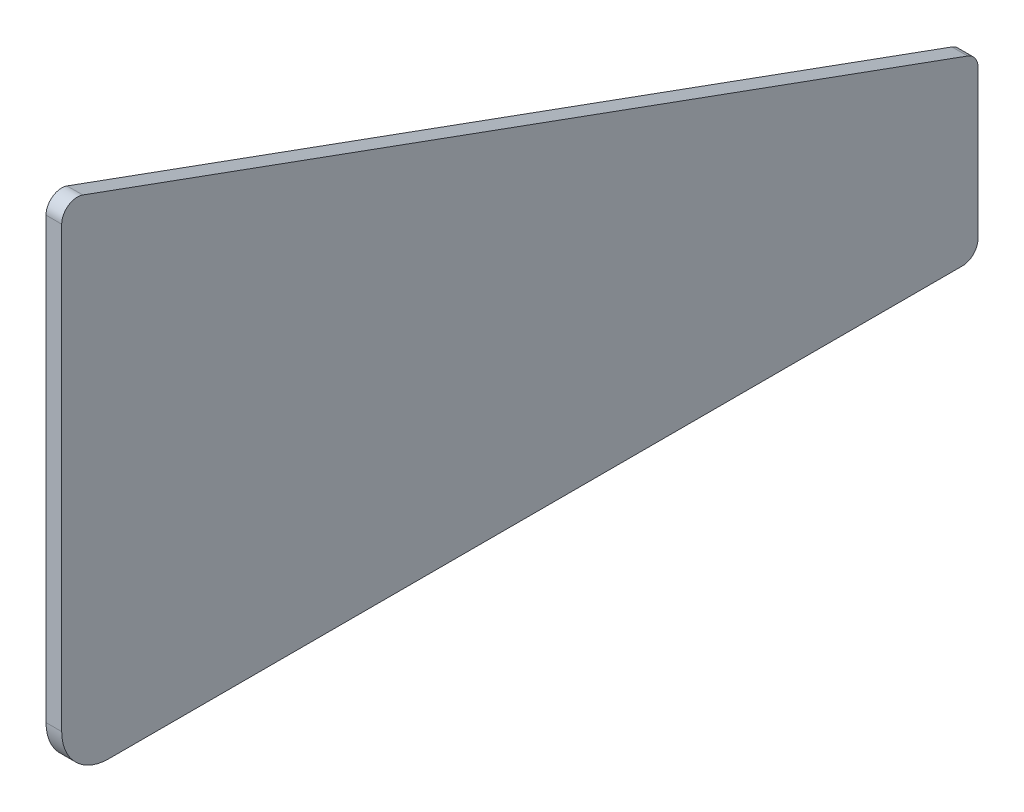
ISO-10303-21;
HEADER;
FILE_DESCRIPTION(('STEP AP214'),'2;1');
FILE_NAME('part.step','',(''),(''),'','','');
FILE_SCHEMA(('AUTOMOTIVE_DESIGN { 1 0 10303 214 1 1 1 1 }'));
ENDSEC;
DATA;
#1=APPLICATION_CONTEXT('core data for automotive mechanical design processes');
#2=APPLICATION_PROTOCOL_DEFINITION('international standard','automotive_design',2000,#1);
#3=PRODUCT_CONTEXT('',#1,'mechanical');
#4=PRODUCT('Part','Part','',(#3));
#5=PRODUCT_RELATED_PRODUCT_CATEGORY('part','',(#4));
#6=PRODUCT_DEFINITION_FORMATION('','',#4);
#7=PRODUCT_DEFINITION_CONTEXT('part definition',#1,'design');
#8=PRODUCT_DEFINITION('design','',#6,#7);
#9=PRODUCT_DEFINITION_SHAPE('','',#8);
#10=(LENGTH_UNIT() NAMED_UNIT(*) SI_UNIT(.MILLI.,.METRE.));
#11=(NAMED_UNIT(*) PLANE_ANGLE_UNIT() SI_UNIT($,.RADIAN.));
#12=(NAMED_UNIT(*) SI_UNIT($,.STERADIAN.) SOLID_ANGLE_UNIT());
#13=UNCERTAINTY_MEASURE_WITH_UNIT(LENGTH_MEASURE(1.E-05),#10,'distance_accuracy_value','');
#14=(GEOMETRIC_REPRESENTATION_CONTEXT(3) GLOBAL_UNCERTAINTY_ASSIGNED_CONTEXT((#13)) GLOBAL_UNIT_ASSIGNED_CONTEXT((#10,
#11,#12)) REPRESENTATION_CONTEXT('',''));
#15=CARTESIAN_POINT('',(0.,0.,0.));
#16=DIRECTION('',(0.,0.,1.));
#17=DIRECTION('',(1.,0.,0.));
#18=AXIS2_PLACEMENT_3D('',#15,#16,#17);
#19=CARTESIAN_POINT('',(10.,-294.281480067421,-30.));
#20=DIRECTION('',(-1.,0.,0.));
#21=DIRECTION('',(0.,0.,1.));
#22=AXIS2_PLACEMENT_3D('',#19,#20,#21);
#23=CYLINDRICAL_SURFACE('',#22,30.);
#24=CARTESIAN_POINT('',(0.,-294.281480067421,-30.));
#25=DIRECTION('',(1.,0.,0.));
#26=DIRECTION('',(0.,0.,1.));
#27=AXIS2_PLACEMENT_3D('',#24,#25,#26);
#28=CIRCLE('',#27,30.);
#29=CARTESIAN_POINT('',(0.,-294.281480067421,0.));
#30=VERTEX_POINT('',#29);
#31=CARTESIAN_POINT('',(0.,-324.281480067421,-30.));
#32=VERTEX_POINT('',#31);
#33=EDGE_CURVE('E240',#30,#32,#28,.T.);
#34=ORIENTED_EDGE('',*,*,#33,.T.);
#35=DIRECTION('',(-1.,0.,0.));
#36=VECTOR('',#35,1.);
#37=CARTESIAN_POINT('',(10.,-324.281480067421,-30.));
#38=LINE('',#37,#36);
#39=CARTESIAN_POINT('',(10.,-324.281480067421,-30.));
#40=VERTEX_POINT('',#39);
#41=EDGE_CURVE('E11',#40,#32,#38,.T.);
#42=ORIENTED_EDGE('',*,*,#41,.F.);
#43=CARTESIAN_POINT('',(10.,-294.281480067421,-30.));
#44=DIRECTION('',(1.,0.,0.));
#45=DIRECTION('',(0.,0.,1.));
#46=AXIS2_PLACEMENT_3D('',#43,#44,#45);
#47=CIRCLE('',#46,30.);
#48=CARTESIAN_POINT('',(10.,-294.281480067421,0.));
#49=VERTEX_POINT('',#48);
#50=EDGE_CURVE('E246',#49,#40,#47,.T.);
#51=ORIENTED_EDGE('',*,*,#50,.F.);
#52=DIRECTION('',(-1.,0.,0.));
#53=VECTOR('',#52,1.);
#54=CARTESIAN_POINT('',(10.,-294.281480067421,0.));
#55=LINE('',#54,#53);
#56=EDGE_CURVE('E264',#49,#30,#55,.T.);
#57=ORIENTED_EDGE('',*,*,#56,.T.);
#58=EDGE_LOOP('',(#34,#42,#51,#57));
#59=FACE_BOUND('',#58,.T.);
#60=ADVANCED_FACE('F34',(#59),#23,.T.);
#61=CARTESIAN_POINT('',(10.,-324.281480067421,-30.));
#62=DIRECTION('',(0.,1.,0.));
#63=DIRECTION('',(0.,0.,1.));
#64=AXIS2_PLACEMENT_3D('',#61,#62,#63);
#65=PLANE('',#64);
#66=DIRECTION('',(0.,0.,-1.));
#67=VECTOR('',#66,1.);
#68=CARTESIAN_POINT('',(0.,-324.281480067421,-30.));
#69=LINE('',#68,#67);
#70=CARTESIAN_POINT('',(0.,-324.281480067421,-573.815572471544));
#71=VERTEX_POINT('',#70);
#72=EDGE_CURVE('E267',#32,#71,#69,.T.);
#73=ORIENTED_EDGE('',*,*,#72,.T.);
#74=DIRECTION('',(-1.,0.,0.));
#75=VECTOR('',#74,1.);
#76=CARTESIAN_POINT('',(10.,-324.281480067421,-573.815572471544));
#77=LINE('',#76,#75);
#78=CARTESIAN_POINT('',(10.,-324.281480067421,-573.815572471544));
#79=VERTEX_POINT('',#78);
#80=EDGE_CURVE('E41',#79,#71,#77,.T.);
#81=ORIENTED_EDGE('',*,*,#80,.F.);
#82=DIRECTION('',(0.,0.,-1.));
#83=VECTOR('',#82,1.);
#84=CARTESIAN_POINT('',(10.,-324.281480067421,-30.));
#85=LINE('',#84,#83);
#86=EDGE_CURVE('E249',#40,#79,#85,.T.);
#87=ORIENTED_EDGE('',*,*,#86,.F.);
#88=ORIENTED_EDGE('',*,*,#41,.T.);
#89=EDGE_LOOP('',(#73,#81,#87,#88));
#90=FACE_BOUND('',#89,.T.);
#91=ADVANCED_FACE('F324',(#90),#65,.F.);
#92=CARTESIAN_POINT('',(10.,-314.281480067421,-573.815572471544));
#93=DIRECTION('',(-1.,0.,0.));
#94=DIRECTION('',(0.,0.,1.));
#95=AXIS2_PLACEMENT_3D('',#92,#93,#94);
#96=CYLINDRICAL_SURFACE('',#95,10.);
#97=CARTESIAN_POINT('',(0.,-314.281480067421,-573.815572471544));
#98=DIRECTION('',(1.,0.,0.));
#99=DIRECTION('',(0.,0.,-1.));
#100=AXIS2_PLACEMENT_3D('',#97,#98,#99);
#101=CIRCLE('',#100,10.);
#102=CARTESIAN_POINT('',(0.,-314.281480067421,-583.815572471544));
#103=VERTEX_POINT('',#102);
#104=EDGE_CURVE('E269',#71,#103,#101,.T.);
#105=ORIENTED_EDGE('',*,*,#104,.T.);
#106=DIRECTION('',(-1.,0.,0.));
#107=VECTOR('',#106,1.);
#108=CARTESIAN_POINT('',(10.,-314.281480067421,-583.815572471544));
#109=LINE('',#108,#107);
#110=CARTESIAN_POINT('',(10.,-314.281480067421,-583.815572471544));
#111=VERTEX_POINT('',#110);
#112=EDGE_CURVE('E294',#111,#103,#109,.T.);
#113=ORIENTED_EDGE('',*,*,#112,.F.);
#114=CARTESIAN_POINT('',(10.,-314.281480067421,-573.815572471544));
#115=DIRECTION('',(1.,0.,0.));
#116=DIRECTION('',(0.,0.,-1.));
#117=AXIS2_PLACEMENT_3D('',#114,#115,#116);
#118=CIRCLE('',#117,10.);
#119=EDGE_CURVE('E252',#79,#111,#118,.T.);
#120=ORIENTED_EDGE('',*,*,#119,.F.);
#121=ORIENTED_EDGE('',*,*,#80,.T.);
#122=EDGE_LOOP('',(#105,#113,#120,#121));
#123=FACE_BOUND('',#122,.T.);
#124=ADVANCED_FACE('F301',(#123),#96,.T.);
#125=CARTESIAN_POINT('',(10.,-314.281480067421,-583.815572471544));
#126=DIRECTION('',(0.,0.,1.));
#127=DIRECTION('',(1.,0.,0.));
#128=AXIS2_PLACEMENT_3D('',#125,#126,#127);
#129=PLANE('',#128);
#130=DIRECTION('',(0.,1.,0.));
#131=VECTOR('',#130,1.);
#132=CARTESIAN_POINT('',(0.,-314.281480067421,-583.815572471544));
#133=LINE('',#132,#131);
#134=CARTESIAN_POINT('',(0.,-219.493566062825,-583.815572471544));
#135=VERTEX_POINT('',#134);
#136=EDGE_CURVE('E271',#103,#135,#133,.T.);
#137=ORIENTED_EDGE('',*,*,#136,.T.);
#138=DIRECTION('',(-1.,0.,0.));
#139=VECTOR('',#138,1.);
#140=CARTESIAN_POINT('',(10.,-219.493566062825,-583.815572471544));
#141=LINE('',#140,#139);
#142=CARTESIAN_POINT('',(10.,-219.493566062825,-583.815572471544));
#143=VERTEX_POINT('',#142);
#144=EDGE_CURVE('E291',#143,#135,#141,.T.);
#145=ORIENTED_EDGE('',*,*,#144,.F.);
#146=DIRECTION('',(0.,1.,0.));
#147=VECTOR('',#146,1.);
#148=CARTESIAN_POINT('',(10.,-314.281480067421,-583.815572471544));
#149=LINE('',#148,#147);
#150=EDGE_CURVE('E254',#111,#143,#149,.T.);
#151=ORIENTED_EDGE('',*,*,#150,.F.);
#152=ORIENTED_EDGE('',*,*,#112,.T.);
#153=EDGE_LOOP('',(#137,#145,#151,#152));
#154=FACE_BOUND('',#153,.T.);
#155=ADVANCED_FACE('F312',(#154),#129,.F.);
#156=CARTESIAN_POINT('',(10.,-219.493566062825,-573.815572471544));
#157=DIRECTION('',(-1.,0.,0.));
#158=DIRECTION('',(0.,0.,1.));
#159=AXIS2_PLACEMENT_3D('',#156,#157,#158);
#160=CYLINDRICAL_SURFACE('',#159,10.);
#161=CARTESIAN_POINT('',(0.,-219.493566062825,-573.815572471544));
#162=DIRECTION('',(1.,0.,0.));
#163=DIRECTION('',(0.,0.,-1.));
#164=AXIS2_PLACEMENT_3D('',#161,#162,#163);
#165=CIRCLE('',#164,10.);
#166=CARTESIAN_POINT('',(0.,-210.096639854966,-577.235773904801));
#167=VERTEX_POINT('',#166);
#168=EDGE_CURVE('E273',#135,#167,#165,.T.);
#169=ORIENTED_EDGE('',*,*,#168,.T.);
#170=DIRECTION('',(-1.,0.,0.));
#171=VECTOR('',#170,1.);
#172=CARTESIAN_POINT('',(10.,-210.096639854966,-577.235773904801));
#173=LINE('',#172,#171);
#174=CARTESIAN_POINT('',(10.,-210.096639854966,-577.235773904801));
#175=VERTEX_POINT('',#174);
#176=EDGE_CURVE('E288',#175,#167,#173,.T.);
#177=ORIENTED_EDGE('',*,*,#176,.F.);
#178=CARTESIAN_POINT('',(10.,-219.493566062825,-573.815572471544));
#179=DIRECTION('',(1.,0.,0.));
#180=DIRECTION('',(0.,0.,-1.));
#181=AXIS2_PLACEMENT_3D('',#178,#179,#180);
#182=CIRCLE('',#181,10.);
#183=EDGE_CURVE('E256',#143,#175,#182,.T.);
#184=ORIENTED_EDGE('',*,*,#183,.F.);
#185=ORIENTED_EDGE('',*,*,#144,.T.);
#186=EDGE_LOOP('',(#169,#177,#184,#185));
#187=FACE_BOUND('',#186,.T.);
#188=ADVANCED_FACE('F316',(#187),#160,.T.);
#189=CARTESIAN_POINT('',(10.,-210.096639854966,-577.235773904801));
#190=DIRECTION('',(0.,-0.939692620785907,0.342020143325672));
#191=DIRECTION('',(0.,-0.342020143325672,-0.939692620785907));
#192=AXIS2_PLACEMENT_3D('',#189,#190,#191);
#193=PLANE('',#192);
#194=DIRECTION('',(0.,0.342020143325672,0.939692620785907));
#195=VECTOR('',#194,1.);
#196=CARTESIAN_POINT('',(0.,-210.096639854966,-577.235773904801));
#197=LINE('',#196,#195);
#198=CARTESIAN_POINT('',(0.,-4.88455385956217,-13.4202014332568));
#199=VERTEX_POINT('',#198);
#200=EDGE_CURVE('E275',#167,#199,#197,.T.);
#201=ORIENTED_EDGE('',*,*,#200,.T.);
#202=DIRECTION('',(-1.,0.,0.));
#203=VECTOR('',#202,1.);
#204=CARTESIAN_POINT('',(10.,-4.88455385956217,-13.4202014332568));
#205=LINE('',#204,#203);
#206=CARTESIAN_POINT('',(10.,-4.88455385956217,-13.4202014332568));
#207=VERTEX_POINT('',#206);
#208=EDGE_CURVE('E285',#207,#199,#205,.T.);
#209=ORIENTED_EDGE('',*,*,#208,.F.);
#210=DIRECTION('',(0.,0.342020143325672,0.939692620785907));
#211=VECTOR('',#210,1.);
#212=CARTESIAN_POINT('',(10.,-210.096639854966,-577.235773904801));
#213=LINE('',#212,#211);
#214=EDGE_CURVE('E258',#175,#207,#213,.T.);
#215=ORIENTED_EDGE('',*,*,#214,.F.);
#216=ORIENTED_EDGE('',*,*,#176,.T.);
#217=EDGE_LOOP('',(#201,#209,#215,#216));
#218=FACE_BOUND('',#217,.T.);
#219=ADVANCED_FACE('F337',(#218),#193,.F.);
#220=CARTESIAN_POINT('',(10.,-14.2814800674212,-10.));
#221=DIRECTION('',(-1.,0.,0.));
#222=DIRECTION('',(0.,0.,1.));
#223=AXIS2_PLACEMENT_3D('',#220,#221,#222);
#224=CYLINDRICAL_SURFACE('',#223,10.);
#225=CARTESIAN_POINT('',(0.,-14.2814800674212,-10.));
#226=DIRECTION('',(1.,0.,0.));
#227=DIRECTION('',(0.,0.,-1.));
#228=AXIS2_PLACEMENT_3D('',#225,#226,#227);
#229=CIRCLE('',#228,10.);
#230=CARTESIAN_POINT('',(0.,-14.2814800674213,0.));
#231=VERTEX_POINT('',#230);
#232=EDGE_CURVE('E277',#199,#231,#229,.T.);
#233=ORIENTED_EDGE('',*,*,#232,.T.);
#234=DIRECTION('',(-1.,0.,0.));
#235=VECTOR('',#234,1.);
#236=CARTESIAN_POINT('',(10.,-14.2814800674213,0.));
#237=LINE('',#236,#235);
#238=CARTESIAN_POINT('',(10.,-14.2814800674213,0.));
#239=VERTEX_POINT('',#238);
#240=EDGE_CURVE('E282',#239,#231,#237,.T.);
#241=ORIENTED_EDGE('',*,*,#240,.F.);
#242=CARTESIAN_POINT('',(10.,-14.2814800674212,-10.));
#243=DIRECTION('',(1.,0.,0.));
#244=DIRECTION('',(0.,0.,-1.));
#245=AXIS2_PLACEMENT_3D('',#242,#243,#244);
#246=CIRCLE('',#245,10.);
#247=EDGE_CURVE('E260',#207,#239,#246,.T.);
#248=ORIENTED_EDGE('',*,*,#247,.F.);
#249=ORIENTED_EDGE('',*,*,#208,.T.);
#250=EDGE_LOOP('',(#233,#241,#248,#249));
#251=FACE_BOUND('',#250,.T.);
#252=ADVANCED_FACE('F335',(#251),#224,.T.);
#253=CARTESIAN_POINT('',(10.,-14.2814800674213,0.));
#254=DIRECTION('',(0.,0.,-1.));
#255=DIRECTION('',(0.,1.,0.));
#256=AXIS2_PLACEMENT_3D('',#253,#254,#255);
#257=PLANE('',#256);
#258=DIRECTION('',(0.,-1.,0.));
#259=VECTOR('',#258,1.);
#260=CARTESIAN_POINT('',(0.,-14.2814800674213,0.));
#261=LINE('',#260,#259);
#262=EDGE_CURVE('E250',#231,#30,#261,.T.);
#263=ORIENTED_EDGE('',*,*,#262,.T.);
#264=ORIENTED_EDGE('',*,*,#56,.F.);
#265=DIRECTION('',(0.,-1.,0.));
#266=VECTOR('',#265,1.);
#267=CARTESIAN_POINT('',(10.,-14.2814800674213,0.));
#268=LINE('',#267,#266);
#269=EDGE_CURVE('E262',#239,#49,#268,.T.);
#270=ORIENTED_EDGE('',*,*,#269,.F.);
#271=ORIENTED_EDGE('',*,*,#240,.T.);
#272=EDGE_LOOP('',(#263,#264,#270,#271));
#273=FACE_BOUND('',#272,.T.);
#274=ADVANCED_FACE('F330',(#273),#257,.F.);
#275=CARTESIAN_POINT('',(10.,-294.281480067421,-30.));
#276=DIRECTION('',(-1.,0.,0.));
#277=DIRECTION('',(0.,0.,1.));
#278=AXIS2_PLACEMENT_3D('',#275,#276,#277);
#279=PLANE('',#278);
#280=ORIENTED_EDGE('',*,*,#50,.T.);
#281=ORIENTED_EDGE('',*,*,#86,.T.);
#282=ORIENTED_EDGE('',*,*,#119,.T.);
#283=ORIENTED_EDGE('',*,*,#150,.T.);
#284=ORIENTED_EDGE('',*,*,#183,.T.);
#285=ORIENTED_EDGE('',*,*,#214,.T.);
#286=ORIENTED_EDGE('',*,*,#247,.T.);
#287=ORIENTED_EDGE('',*,*,#269,.T.);
#288=EDGE_LOOP('',(#280,#281,#282,#283,#284,#285,#286,#287));
#289=FACE_BOUND('',#288,.T.);
#290=ADVANCED_FACE('F320',(#289),#279,.F.);
#291=CARTESIAN_POINT('',(0.,-294.281480067421,-30.));
#292=DIRECTION('',(-1.,0.,0.));
#293=DIRECTION('',(0.,0.,1.));
#294=AXIS2_PLACEMENT_3D('',#291,#292,#293);
#295=PLANE('',#294);
#296=CARTESIAN_POINT('',(0.,-205.316311304833,-356.320107689534));
#297=CARTESIAN_POINT('',(0.,-205.964445920581,-352.838937222534));
#298=CARTESIAN_POINT('',(0.,-217.989087479131,-121.396454164475));
#299=CARTESIAN_POINT('',(0.,-66.6295550857602,-35.3127262433403));
#300=CARTESIAN_POINT('',(0.,-47.7372149956287,-26.9501856712703));
#301=B_SPLINE_CURVE_WITH_KNOTS('',3,(#296,#297,#298,#299,#300),.UNSPECIFIED.,.F.,.F.,(4,1,4),
(0.,0.409684669558369,1.),.UNSPECIFIED.);
#302=CARTESIAN_POINT('',(0.,-205.316311304832,-356.320107689534));
#303=VERTEX_POINT('',#302);
#304=CARTESIAN_POINT('',(0.,-47.7372149956287,-26.9501856712703));
#305=VERTEX_POINT('',#304);
#306=EDGE_CURVE('E48',#303,#305,#301,.T.);
#307=ORIENTED_EDGE('',*,*,#306,.F.);
#308=CARTESIAN_POINT('',(0.,-188.394419043439,-353.169539728973));
#309=DIRECTION('',(-1.,0.,0.));
#310=DIRECTION('',(0.,0.,1.));
#311=AXIS2_PLACEMENT_3D('',#308,#309,#310);
#312=CIRCLE('',#311,17.2126847464395);
#313=CARTESIAN_POINT('',(0.,-171.181734297002,-353.169530365349));
#314=VERTEX_POINT('',#313);
#315=EDGE_CURVE('E166',#314,#303,#312,.T.);
#316=ORIENTED_EDGE('',*,*,#315,.F.);
#317=CARTESIAN_POINT('',(0.,-39.1543533593346,-35.1249178966076));
#318=CARTESIAN_POINT('',(0.,-45.1224459351378,-50.6029528282735));
#319=CARTESIAN_POINT('',(0.,-170.661871262547,-99.0425390004754));
#320=CARTESIAN_POINT('',(0.,-171.181746235272,-331.224003862466));
#321=CARTESIAN_POINT('',(0.,-171.181734297002,-353.169530365349));
#322=B_SPLINE_CURVE_WITH_KNOTS('',3,(#317,#318,#319,#320,#321),.UNSPECIFIED.,.F.,.F.,(4,1,4),
(0.,0.639195597187541,1.),.UNSPECIFIED.);
#323=CARTESIAN_POINT('',(0.,-39.1543533593346,-35.1249178966076));
#324=VERTEX_POINT('',#323);
#325=EDGE_CURVE('E169',#324,#314,#322,.T.);
#326=ORIENTED_EDGE('',*,*,#325,.F.);
#327=CARTESIAN_POINT('',(0.,-45.1404123394199,-32.8167854808913));
#328=DIRECTION('',(-1.,0.,0.));
#329=DIRECTION('',(0.,0.,1.));
#330=AXIS2_PLACEMENT_3D('',#327,#328,#329);
#331=CIRCLE('',#330,6.41563538252756);
#332=EDGE_CURVE('E486',#305,#324,#331,.T.);
#333=ORIENTED_EDGE('',*,*,#332,.F.);
#334=EDGE_LOOP('',(#307,#316,#326,#333));
#335=FACE_BOUND('',#334,.T.);
#336=CARTESIAN_POINT('',(0.,-291.831036848789,-549.474047025916));
#337=CARTESIAN_POINT('',(0.,-306.502271197421,-474.750080898962));
#338=CARTESIAN_POINT('',(0.,-324.572171749127,-284.669923622883));
#339=CARTESIAN_POINT('',(0.,-266.034178467192,-143.080818041075));
#340=CARTESIAN_POINT('',(0.,-218.017297736922,-23.1621757846725));
#341=B_SPLINE_CURVE_WITH_KNOTS('',3,(#336,#337,#338,#339,#340),.UNSPECIFIED.,.F.,.F.,(4,1,4),
(0.,0.423888314021505,1.),.UNSPECIFIED.);
#342=CARTESIAN_POINT('',(0.,-291.831036848789,-549.474047025916));
#343=VERTEX_POINT('',#342);
#344=CARTESIAN_POINT('',(0.,-218.017297736922,-23.1621757846725));
#345=VERTEX_POINT('',#344);
#346=EDGE_CURVE('E56',#343,#345,#341,.T.);
#347=ORIENTED_EDGE('',*,*,#346,.F.);
#348=CARTESIAN_POINT('',(0.,-274.942255754465,-546.15811937726));
#349=DIRECTION('',(-1.,0.,0.));
#350=DIRECTION('',(0.,0.,1.));
#351=AXIS2_PLACEMENT_3D('',#348,#349,#350);
#352=CIRCLE('',#351,17.2112260755334);
#353=CARTESIAN_POINT('',(0.,-257.731029978854,-546.154906268973));
#354=VERTEX_POINT('',#353);
#355=EDGE_CURVE('E231',#354,#343,#352,.T.);
#356=ORIENTED_EDGE('',*,*,#355,.F.);
#357=CARTESIAN_POINT('',(0.,-200.318314743193,-26.7381200613058));
#358=CARTESIAN_POINT('',(0.,-200.660753586686,-45.9143544336099));
#359=CARTESIAN_POINT('',(0.,-255.510398156368,-151.321073340182));
#360=CARTESIAN_POINT('',(0.,-286.385074175091,-414.880335600918));
#361=CARTESIAN_POINT('',(0.,-257.731725159021,-542.431128001591));
#362=CARTESIAN_POINT('',(0.,-257.731029978854,-546.154906268973));
#363=B_SPLINE_CURVE_WITH_KNOTS('',3,(#357,#358,#359,#360,#361,#362),.UNSPECIFIED.,.F.,.F.,(4,1,
1,4),(0.,0.560935224009475,0.660935224009475,1.),.UNSPECIFIED.);
#364=CARTESIAN_POINT('',(0.,-200.318314743193,-26.7381200613058));
#365=VERTEX_POINT('',#364);
#366=EDGE_CURVE('E226',#365,#354,#363,.T.);
#367=ORIENTED_EDGE('',*,*,#366,.F.);
#368=CARTESIAN_POINT('',(0.,-209.495939813425,-26.5742309862116));
#369=DIRECTION('',(-1.,0.,0.));
#370=DIRECTION('',(0.,0.,1.));
#371=AXIS2_PLACEMENT_3D('',#368,#369,#370);
#372=CIRCLE('',#371,9.17908827491534);
#373=EDGE_CURVE('E219',#345,#365,#372,.T.);
#374=ORIENTED_EDGE('',*,*,#373,.F.);
#375=EDGE_LOOP('',(#347,#356,#367,#374));
#376=FACE_BOUND('',#375,.T.);
#377=ORIENTED_EDGE('',*,*,#33,.F.);
#378=ORIENTED_EDGE('',*,*,#262,.F.);
#379=ORIENTED_EDGE('',*,*,#232,.F.);
#380=ORIENTED_EDGE('',*,*,#200,.F.);
#381=ORIENTED_EDGE('',*,*,#168,.F.);
#382=ORIENTED_EDGE('',*,*,#136,.F.);
#383=ORIENTED_EDGE('',*,*,#104,.F.);
#384=ORIENTED_EDGE('',*,*,#72,.F.);
#385=EDGE_LOOP('',(#377,#378,#379,#380,#381,#382,#383,#384));
#386=FACE_BOUND('',#385,.T.);
#387=ADVANCED_FACE('F307',(#335,#376,#386),#295,.T.);
#388=CARTESIAN_POINT('',(3.,-291.831036848789,-549.474047025916));
#389=CARTESIAN_POINT('',(3.,-306.502271197421,-474.750080898962));
#390=CARTESIAN_POINT('',(3.,-324.572171749127,-284.669923622883));
#391=CARTESIAN_POINT('',(3.,-266.034178467192,-143.080818041075));
#392=CARTESIAN_POINT('',(3.,-218.017297736922,-23.1621757846725));
#393=B_SPLINE_CURVE_WITH_KNOTS('',3,(#388,#389,#390,#391,#392),.UNSPECIFIED.,.F.,.F.,(4,1,4),
(0.,0.423888314021505,1.),.UNSPECIFIED.);
#394=DIRECTION('',(-1.,0.,0.));
#395=VECTOR('',#394,1.);
#396=SURFACE_OF_LINEAR_EXTRUSION('',#393,#395);
#397=ORIENTED_EDGE('',*,*,#346,.T.);
#398=DIRECTION('',(-1.,0.,0.));
#399=VECTOR('',#398,1.);
#400=CARTESIAN_POINT('',(3.,-218.017297736922,-23.1621757846725));
#401=LINE('',#400,#399);
#402=CARTESIAN_POINT('',(3.,-218.017297736922,-23.1621757846725));
#403=VERTEX_POINT('',#402);
#404=EDGE_CURVE('E215',#403,#345,#401,.T.);
#405=ORIENTED_EDGE('',*,*,#404,.F.);
#406=CARTESIAN_POINT('',(3.,-291.831036848789,-549.474047025916));
#407=VERTEX_POINT('',#406);
#408=EDGE_CURVE('E237',#407,#403,#393,.T.);
#409=ORIENTED_EDGE('',*,*,#408,.F.);
#410=DIRECTION('',(-1.,0.,0.));
#411=VECTOR('',#410,1.);
#412=CARTESIAN_POINT('',(3.,-291.831036848789,-549.474047025916));
#413=LINE('',#412,#411);
#414=EDGE_CURVE('E238',#407,#343,#413,.T.);
#415=ORIENTED_EDGE('',*,*,#414,.T.);
#416=EDGE_LOOP('',(#397,#405,#409,#415));
#417=FACE_BOUND('',#416,.T.);
#418=ADVANCED_FACE('F193',(#417),#396,.F.);
#419=CARTESIAN_POINT('',(3.,-274.942255754465,-546.15811937726));
#420=DIRECTION('',(-1.,0.,0.));
#421=DIRECTION('',(0.,0.,1.));
#422=AXIS2_PLACEMENT_3D('',#419,#420,#421);
#423=CYLINDRICAL_SURFACE('',#422,17.2112260755334);
#424=ORIENTED_EDGE('',*,*,#355,.T.);
#425=ORIENTED_EDGE('',*,*,#414,.F.);
#426=CARTESIAN_POINT('',(3.,-274.942255754465,-546.15811937726));
#427=DIRECTION('',(-1.,0.,0.));
#428=DIRECTION('',(0.,0.,1.));
#429=AXIS2_PLACEMENT_3D('',#426,#427,#428);
#430=CIRCLE('',#429,17.2112260755334);
#431=CARTESIAN_POINT('',(3.,-257.731029978854,-546.154906268973));
#432=VERTEX_POINT('',#431);
#433=EDGE_CURVE('E207',#432,#407,#430,.T.);
#434=ORIENTED_EDGE('',*,*,#433,.F.);
#435=DIRECTION('',(-1.,0.,0.));
#436=VECTOR('',#435,1.);
#437=CARTESIAN_POINT('',(3.,-257.731029978854,-546.154906268973));
#438=LINE('',#437,#436);
#439=EDGE_CURVE('E241',#432,#354,#438,.T.);
#440=ORIENTED_EDGE('',*,*,#439,.T.);
#441=EDGE_LOOP('',(#424,#425,#434,#440));
#442=FACE_BOUND('',#441,.T.);
#443=ADVANCED_FACE('F189',(#442),#423,.F.);
#444=CARTESIAN_POINT('',(3.,-200.318314743193,-26.7381200613058));
#445=CARTESIAN_POINT('',(3.,-200.660753586686,-45.9143544336099));
#446=CARTESIAN_POINT('',(3.,-255.510398156368,-151.321073340182));
#447=CARTESIAN_POINT('',(3.,-286.385074175091,-414.880335600918));
#448=CARTESIAN_POINT('',(3.,-257.731725159021,-542.431128001591));
#449=CARTESIAN_POINT('',(3.,-257.731029978854,-546.154906268973));
#450=B_SPLINE_CURVE_WITH_KNOTS('',3,(#444,#445,#446,#447,#448,#449),.UNSPECIFIED.,.F.,.F.,(4,1,
1,4),(0.,0.560935224009475,0.660935224009475,1.),.UNSPECIFIED.);
#451=DIRECTION('',(-1.,0.,0.));
#452=VECTOR('',#451,1.);
#453=SURFACE_OF_LINEAR_EXTRUSION('',#450,#452);
#454=ORIENTED_EDGE('',*,*,#366,.T.);
#455=ORIENTED_EDGE('',*,*,#439,.F.);
#456=CARTESIAN_POINT('',(3.,-200.318314743193,-26.7381200613058));
#457=VERTEX_POINT('',#456);
#458=EDGE_CURVE('E200',#457,#432,#450,.T.);
#459=ORIENTED_EDGE('',*,*,#458,.F.);
#460=DIRECTION('',(-1.,0.,0.));
#461=VECTOR('',#460,1.);
#462=CARTESIAN_POINT('',(3.,-200.318314743193,-26.7381200613058));
#463=LINE('',#462,#461);
#464=EDGE_CURVE('E243',#457,#365,#463,.T.);
#465=ORIENTED_EDGE('',*,*,#464,.T.);
#466=EDGE_LOOP('',(#454,#455,#459,#465));
#467=FACE_BOUND('',#466,.T.);
#468=ADVANCED_FACE('F192',(#467),#453,.F.);
#469=CARTESIAN_POINT('',(3.,-209.495939813425,-26.5742309862116));
#470=DIRECTION('',(-1.,0.,0.));
#471=DIRECTION('',(0.,0.,1.));
#472=AXIS2_PLACEMENT_3D('',#469,#470,#471);
#473=CYLINDRICAL_SURFACE('',#472,9.17908827491534);
#474=ORIENTED_EDGE('',*,*,#373,.T.);
#475=ORIENTED_EDGE('',*,*,#464,.F.);
#476=CARTESIAN_POINT('',(3.,-209.495939813425,-26.5742309862116));
#477=DIRECTION('',(-1.,0.,0.));
#478=DIRECTION('',(0.,0.,1.));
#479=AXIS2_PLACEMENT_3D('',#476,#477,#478);
#480=CIRCLE('',#479,9.17908827491534);
#481=EDGE_CURVE('E208',#403,#457,#480,.T.);
#482=ORIENTED_EDGE('',*,*,#481,.F.);
#483=ORIENTED_EDGE('',*,*,#404,.T.);
#484=EDGE_LOOP('',(#474,#475,#482,#483));
#485=FACE_BOUND('',#484,.T.);
#486=ADVANCED_FACE('F187',(#485),#473,.F.);
#487=CARTESIAN_POINT('',(3.,-303.462035884563,-284.326105547402));
#488=DIRECTION('',(1.,0.,0.));
#489=DIRECTION('',(0.,0.,-1.));
#490=AXIS2_PLACEMENT_3D('',#487,#488,#489);
#491=PLANE('',#490);
#492=ORIENTED_EDGE('',*,*,#408,.T.);
#493=ORIENTED_EDGE('',*,*,#481,.T.);
#494=ORIENTED_EDGE('',*,*,#458,.T.);
#495=ORIENTED_EDGE('',*,*,#433,.T.);
#496=EDGE_LOOP('',(#492,#493,#494,#495));
#497=FACE_BOUND('',#496,.T.);
#498=ADVANCED_FACE('F183',(#497),#491,.F.);
#499=CARTESIAN_POINT('',(3.,-205.316311304833,-356.320107689534));
#500=CARTESIAN_POINT('',(3.,-205.964445920581,-352.838937222534));
#501=CARTESIAN_POINT('',(3.,-217.989087479131,-121.396454164475));
#502=CARTESIAN_POINT('',(3.,-66.6295550857602,-35.3127262433403));
#503=CARTESIAN_POINT('',(3.,-47.7372149956287,-26.9501856712703));
#504=B_SPLINE_CURVE_WITH_KNOTS('',3,(#499,#500,#501,#502,#503),.UNSPECIFIED.,.F.,.F.,(4,1,4),
(0.,0.409684669558369,1.),.UNSPECIFIED.);
#505=DIRECTION('',(-1.,0.,0.));
#506=VECTOR('',#505,1.);
#507=SURFACE_OF_LINEAR_EXTRUSION('',#504,#506);
#508=ORIENTED_EDGE('',*,*,#306,.T.);
#509=DIRECTION('',(-1.,0.,0.));
#510=VECTOR('',#509,1.);
#511=CARTESIAN_POINT('',(3.,-47.7372149956287,-26.9501856712703));
#512=LINE('',#511,#510);
#513=CARTESIAN_POINT('',(3.,-47.7372149956287,-26.9501856712703));
#514=VERTEX_POINT('',#513);
#515=EDGE_CURVE('E144',#514,#305,#512,.T.);
#516=ORIENTED_EDGE('',*,*,#515,.F.);
#517=CARTESIAN_POINT('',(3.,-205.316311304832,-356.320107689534));
#518=VERTEX_POINT('',#517);
#519=EDGE_CURVE('E148',#518,#514,#504,.T.);
#520=ORIENTED_EDGE('',*,*,#519,.F.);
#521=DIRECTION('',(-1.,0.,0.));
#522=VECTOR('',#521,1.);
#523=CARTESIAN_POINT('',(3.,-205.316311304832,-356.320107689534));
#524=LINE('',#523,#522);
#525=EDGE_CURVE('E220',#518,#303,#524,.T.);
#526=ORIENTED_EDGE('',*,*,#525,.T.);
#527=EDGE_LOOP('',(#508,#516,#520,#526));
#528=FACE_BOUND('',#527,.T.);
#529=ADVANCED_FACE('F146',(#528),#507,.F.);
#530=CARTESIAN_POINT('',(3.,-188.394419043439,-353.169539728973));
#531=DIRECTION('',(-1.,0.,0.));
#532=DIRECTION('',(0.,0.,1.));
#533=AXIS2_PLACEMENT_3D('',#530,#531,#532);
#534=CYLINDRICAL_SURFACE('',#533,17.2126847464395);
#535=ORIENTED_EDGE('',*,*,#315,.T.);
#536=ORIENTED_EDGE('',*,*,#525,.F.);
#537=CARTESIAN_POINT('',(3.,-188.394419043439,-353.169539728973));
#538=DIRECTION('',(-1.,0.,0.));
#539=DIRECTION('',(0.,0.,1.));
#540=AXIS2_PLACEMENT_3D('',#537,#538,#539);
#541=CIRCLE('',#540,17.2126847464395);
#542=CARTESIAN_POINT('',(3.,-171.181734297002,-353.169530365349));
#543=VERTEX_POINT('',#542);
#544=EDGE_CURVE('E154',#543,#518,#541,.T.);
#545=ORIENTED_EDGE('',*,*,#544,.F.);
#546=DIRECTION('',(-1.,0.,0.));
#547=VECTOR('',#546,1.);
#548=CARTESIAN_POINT('',(3.,-171.181734297002,-353.169530365349));
#549=LINE('',#548,#547);
#550=EDGE_CURVE('E499',#543,#314,#549,.T.);
#551=ORIENTED_EDGE('',*,*,#550,.T.);
#552=EDGE_LOOP('',(#535,#536,#545,#551));
#553=FACE_BOUND('',#552,.T.);
#554=ADVANCED_FACE('F182',(#553),#534,.F.);
#555=CARTESIAN_POINT('',(3.,-39.1543533593346,-35.1249178966076));
#556=CARTESIAN_POINT('',(3.,-45.1224459351378,-50.6029528282735));
#557=CARTESIAN_POINT('',(3.,-170.661871262547,-99.0425390004754));
#558=CARTESIAN_POINT('',(3.,-171.181746235272,-331.224003862466));
#559=CARTESIAN_POINT('',(3.,-171.181734297002,-353.169530365349));
#560=B_SPLINE_CURVE_WITH_KNOTS('',3,(#555,#556,#557,#558,#559),.UNSPECIFIED.,.F.,.F.,(4,1,4),
(0.,0.639195597187541,1.),.UNSPECIFIED.);
#561=DIRECTION('',(-1.,0.,0.));
#562=VECTOR('',#561,1.);
#563=SURFACE_OF_LINEAR_EXTRUSION('',#560,#562);
#564=ORIENTED_EDGE('',*,*,#325,.T.);
#565=ORIENTED_EDGE('',*,*,#550,.F.);
#566=CARTESIAN_POINT('',(3.,-39.1543533593346,-35.1249178966076));
#567=VERTEX_POINT('',#566);
#568=EDGE_CURVE('E162',#567,#543,#560,.T.);
#569=ORIENTED_EDGE('',*,*,#568,.F.);
#570=DIRECTION('',(-1.,0.,0.));
#571=VECTOR('',#570,1.);
#572=CARTESIAN_POINT('',(3.,-39.1543533593346,-35.1249178966076));
#573=LINE('',#572,#571);
#574=EDGE_CURVE('E153',#567,#324,#573,.T.);
#575=ORIENTED_EDGE('',*,*,#574,.T.);
#576=EDGE_LOOP('',(#564,#565,#569,#575));
#577=FACE_BOUND('',#576,.T.);
#578=ADVANCED_FACE('F447',(#577),#563,.F.);
#579=CARTESIAN_POINT('',(3.,-45.1404123394199,-32.8167854808913));
#580=DIRECTION('',(-1.,0.,0.));
#581=DIRECTION('',(0.,0.,1.));
#582=AXIS2_PLACEMENT_3D('',#579,#580,#581);
#583=CYLINDRICAL_SURFACE('',#582,6.41563538252756);
#584=ORIENTED_EDGE('',*,*,#332,.T.);
#585=ORIENTED_EDGE('',*,*,#574,.F.);
#586=CARTESIAN_POINT('',(3.,-45.1404123394199,-32.8167854808913));
#587=DIRECTION('',(-1.,0.,0.));
#588=DIRECTION('',(0.,0.,1.));
#589=AXIS2_PLACEMENT_3D('',#586,#587,#588);
#590=CIRCLE('',#589,6.41563538252756);
#591=EDGE_CURVE('E157',#514,#567,#590,.T.);
#592=ORIENTED_EDGE('',*,*,#591,.F.);
#593=ORIENTED_EDGE('',*,*,#515,.T.);
#594=EDGE_LOOP('',(#584,#585,#592,#593));
#595=FACE_BOUND('',#594,.T.);
#596=ADVANCED_FACE('F158',(#595),#583,.F.);
#597=CARTESIAN_POINT('',(3.,-169.974525325643,-144.553707246626));
#598=DIRECTION('',(1.,0.,0.));
#599=DIRECTION('',(0.,0.,-1.));
#600=AXIS2_PLACEMENT_3D('',#597,#598,#599);
#601=PLANE('',#600);
#602=ORIENTED_EDGE('',*,*,#519,.T.);
#603=ORIENTED_EDGE('',*,*,#591,.T.);
#604=ORIENTED_EDGE('',*,*,#568,.T.);
#605=ORIENTED_EDGE('',*,*,#544,.T.);
#606=EDGE_LOOP('',(#602,#603,#604,#605));
#607=FACE_BOUND('',#606,.T.);
#608=ADVANCED_FACE('F164',(#607),#601,.F.);
#609=CLOSED_SHELL('',(#60,#91,#124,#155,#188,#219,#252,#274,#290,#387,#418,#443,#468,#486,#498,
#529,#554,#578,#596,#608));
#610=MANIFOLD_SOLID_BREP('B2',#609);
#611=ADVANCED_BREP_SHAPE_REPRESENTATION('',(#18,#610),#14);
#612=SHAPE_DEFINITION_REPRESENTATION(#9,#611);
ENDSEC;
END-ISO-10303-21;
